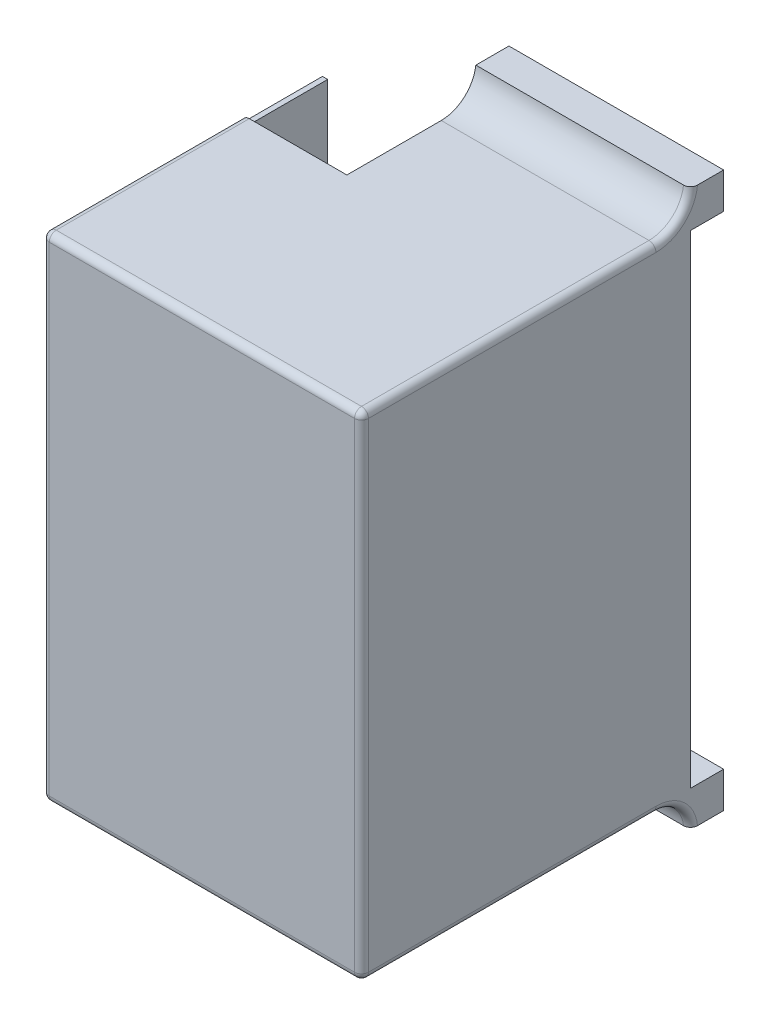
ISO-10303-21;
HEADER;
FILE_DESCRIPTION(('STEP AP214'),'2;1');
FILE_NAME('part.step','',(''),(''),'','','');
FILE_SCHEMA(('AUTOMOTIVE_DESIGN { 1 0 10303 214 1 1 1 1 }'));
ENDSEC;
DATA;
#1=APPLICATION_CONTEXT('core data for automotive mechanical design processes');
#2=APPLICATION_PROTOCOL_DEFINITION('international standard','automotive_design',2000,#1);
#3=PRODUCT_CONTEXT('',#1,'mechanical');
#4=PRODUCT('Part','Part','',(#3));
#5=PRODUCT_RELATED_PRODUCT_CATEGORY('part','',(#4));
#6=PRODUCT_DEFINITION_FORMATION('','',#4);
#7=PRODUCT_DEFINITION_CONTEXT('part definition',#1,'design');
#8=PRODUCT_DEFINITION('design','',#6,#7);
#9=PRODUCT_DEFINITION_SHAPE('','',#8);
#10=(LENGTH_UNIT() NAMED_UNIT(*) SI_UNIT(.MILLI.,.METRE.));
#11=(NAMED_UNIT(*) PLANE_ANGLE_UNIT() SI_UNIT($,.RADIAN.));
#12=(NAMED_UNIT(*) SI_UNIT($,.STERADIAN.) SOLID_ANGLE_UNIT());
#13=UNCERTAINTY_MEASURE_WITH_UNIT(LENGTH_MEASURE(1.E-05),#10,'distance_accuracy_value','');
#14=(GEOMETRIC_REPRESENTATION_CONTEXT(3) GLOBAL_UNCERTAINTY_ASSIGNED_CONTEXT((#13)) GLOBAL_UNIT_ASSIGNED_CONTEXT((#10,
#11,#12)) REPRESENTATION_CONTEXT('',''));
#15=CARTESIAN_POINT('',(0.,0.,0.));
#16=DIRECTION('',(0.,0.,1.));
#17=DIRECTION('',(1.,0.,0.));
#18=AXIS2_PLACEMENT_3D('',#15,#16,#17);
#19=CARTESIAN_POINT('',(91.6,0.,0.));
#20=DIRECTION('',(0.,0.,1.));
#21=DIRECTION('',(1.,0.,0.));
#22=AXIS2_PLACEMENT_3D('',#19,#20,#21);
#23=PLANE('',#22);
#24=DIRECTION('',(-1.,0.,0.));
#25=VECTOR('',#24,1.);
#26=CARTESIAN_POINT('',(91.6,140.1,0.));
#27=LINE('',#26,#25);
#28=CARTESIAN_POINT('',(91.6,140.1,0.));
#29=VERTEX_POINT('',#28);
#30=CARTESIAN_POINT('',(90.1,140.1,0.));
#31=VERTEX_POINT('',#30);
#32=EDGE_CURVE('E628',#29,#31,#27,.T.);
#33=ORIENTED_EDGE('',*,*,#32,.F.);
#34=DIRECTION('',(0.,1.,0.));
#35=VECTOR('',#34,1.);
#36=CARTESIAN_POINT('',(91.6,0.,0.));
#37=LINE('',#36,#35);
#38=CARTESIAN_POINT('',(91.6,1.5,0.));
#39=VERTEX_POINT('',#38);
#40=EDGE_CURVE('E321',#39,#29,#37,.T.);
#41=ORIENTED_EDGE('',*,*,#40,.F.);
#42=DIRECTION('',(1.,0.,0.));
#43=VECTOR('',#42,1.);
#44=CARTESIAN_POINT('',(91.6,1.5,0.));
#45=LINE('',#44,#43);
#46=CARTESIAN_POINT('',(90.1,1.5,0.));
#47=VERTEX_POINT('',#46);
#48=EDGE_CURVE('E347',#47,#39,#45,.T.);
#49=ORIENTED_EDGE('',*,*,#48,.F.);
#50=DIRECTION('',(0.,1.,0.));
#51=VECTOR('',#50,1.);
#52=CARTESIAN_POINT('',(90.1,0.,0.));
#53=LINE('',#52,#51);
#54=EDGE_CURVE('E305',#47,#31,#53,.T.);
#55=ORIENTED_EDGE('',*,*,#54,.T.);
#56=EDGE_LOOP('',(#33,#41,#49,#55));
#57=FACE_BOUND('',#56,.T.);
#58=ADVANCED_FACE('F47',(#57),#23,.F.);
#59=CARTESIAN_POINT('',(91.6,0.,0.));
#60=DIRECTION('',(0.,1.,0.));
#61=DIRECTION('',(0.,0.,1.));
#62=AXIS2_PLACEMENT_3D('',#59,#60,#61);
#63=PLANE('',#62);
#64=DIRECTION('',(-1.,0.,0.));
#65=VECTOR('',#64,1.);
#66=CARTESIAN_POINT('',(91.6,0.,92.4));
#67=LINE('',#66,#65);
#68=CARTESIAN_POINT('',(89.6,0.,92.4));
#69=VERTEX_POINT('',#68);
#70=CARTESIAN_POINT('',(2.,0.,92.4));
#71=VERTEX_POINT('',#70);
#72=EDGE_CURVE('E564',#69,#71,#67,.T.);
#73=ORIENTED_EDGE('',*,*,#72,.T.);
#74=DIRECTION('',(0.,0.,-1.));
#75=VECTOR('',#74,1.);
#76=CARTESIAN_POINT('',(2.,0.,14.));
#77=LINE('',#76,#75);
#78=CARTESIAN_POINT('',(2.,0.,14.));
#79=VERTEX_POINT('',#78);
#80=EDGE_CURVE('E611',#71,#79,#77,.T.);
#81=ORIENTED_EDGE('',*,*,#80,.T.);
#82=DIRECTION('',(0.,0.,1.));
#83=VECTOR('',#82,1.);
#84=CARTESIAN_POINT('',(2.,0.,0.));
#85=LINE('',#84,#83);
#86=CARTESIAN_POINT('',(2.,0.,9.92773891679268));
#87=VERTEX_POINT('',#86);
#88=EDGE_CURVE('E288',#87,#79,#85,.T.);
#89=ORIENTED_EDGE('',*,*,#88,.F.);
#90=DIRECTION('',(-1.,0.,0.));
#91=VECTOR('',#90,1.);
#92=CARTESIAN_POINT('',(91.6,0.,9.92773891679268));
#93=LINE('',#92,#91);
#94=CARTESIAN_POINT('',(89.6,0.,9.92773891679268));
#95=VERTEX_POINT('',#94);
#96=EDGE_CURVE('E348',#87,#95,#93,.F.);
#97=ORIENTED_EDGE('',*,*,#96,.T.);
#98=DIRECTION('',(0.,0.,-1.));
#99=VECTOR('',#98,1.);
#100=CARTESIAN_POINT('',(89.6,0.,0.));
#101=LINE('',#100,#99);
#102=EDGE_CURVE('E568',#95,#69,#101,.F.);
#103=ORIENTED_EDGE('',*,*,#102,.T.);
#104=EDGE_LOOP('',(#73,#81,#89,#97,#103));
#105=FACE_BOUND('',#104,.T.);
#106=ADVANCED_FACE('F466',(#105),#63,.F.);
#107=CARTESIAN_POINT('',(91.6,141.6,0.));
#108=DIRECTION('',(0.,-1.,0.));
#109=DIRECTION('',(0.,0.,-1.));
#110=AXIS2_PLACEMENT_3D('',#107,#108,#109);
#111=PLANE('',#110);
#112=DIRECTION('',(1.,0.,0.));
#113=VECTOR('',#112,1.);
#114=CARTESIAN_POINT('',(30.,141.6,37.));
#115=LINE('',#114,#113);
#116=CARTESIAN_POINT('',(2.00000000000001,141.6,37.));
#117=VERTEX_POINT('',#116);
#118=CARTESIAN_POINT('',(30.,141.6,37.));
#119=VERTEX_POINT('',#118);
#120=EDGE_CURVE('E267',#117,#119,#115,.T.);
#121=ORIENTED_EDGE('',*,*,#120,.F.);
#122=DIRECTION('',(0.,0.,1.));
#123=VECTOR('',#122,1.);
#124=CARTESIAN_POINT('',(2.,141.6,94.4));
#125=LINE('',#124,#123);
#126=CARTESIAN_POINT('',(2.,141.6,92.4));
#127=VERTEX_POINT('',#126);
#128=EDGE_CURVE('E591',#117,#127,#125,.T.);
#129=ORIENTED_EDGE('',*,*,#128,.T.);
#130=DIRECTION('',(-1.,0.,0.));
#131=VECTOR('',#130,1.);
#132=CARTESIAN_POINT('',(91.6,141.6,92.4));
#133=LINE('',#132,#131);
#134=CARTESIAN_POINT('',(89.6,141.6,92.4));
#135=VERTEX_POINT('',#134);
#136=EDGE_CURVE('E596',#127,#135,#133,.F.);
#137=ORIENTED_EDGE('',*,*,#136,.T.);
#138=DIRECTION('',(0.,0.,1.));
#139=VECTOR('',#138,1.);
#140=CARTESIAN_POINT('',(89.6,141.6,0.));
#141=LINE('',#140,#139);
#142=CARTESIAN_POINT('',(89.6,141.6,9.92773891679269));
#143=VERTEX_POINT('',#142);
#144=EDGE_CURVE('E500',#135,#143,#141,.F.);
#145=ORIENTED_EDGE('',*,*,#144,.T.);
#146=DIRECTION('',(1.,0.,0.));
#147=VECTOR('',#146,1.);
#148=CARTESIAN_POINT('',(91.6,141.6,9.92773891679269));
#149=LINE('',#148,#147);
#150=CARTESIAN_POINT('',(30.,141.6,9.92773891679269));
#151=VERTEX_POINT('',#150);
#152=EDGE_CURVE('E352',#143,#151,#149,.F.);
#153=ORIENTED_EDGE('',*,*,#152,.T.);
#154=DIRECTION('',(0.,0.,-1.));
#155=VECTOR('',#154,1.);
#156=CARTESIAN_POINT('',(30.,141.6,0.));
#157=LINE('',#156,#155);
#158=EDGE_CURVE('E256',#119,#151,#157,.T.);
#159=ORIENTED_EDGE('',*,*,#158,.F.);
#160=EDGE_LOOP('',(#121,#129,#137,#145,#153,#159));
#161=FACE_BOUND('',#160,.T.);
#162=ADVANCED_FACE('F463',(#161),#111,.F.);
#163=CARTESIAN_POINT('',(91.6,0.,94.4));
#164=DIRECTION('',(0.,0.,-1.));
#165=DIRECTION('',(-1.,0.,0.));
#166=AXIS2_PLACEMENT_3D('',#163,#164,#165);
#167=PLANE('',#166);
#168=DIRECTION('',(-1.,0.,0.));
#169=VECTOR('',#168,1.);
#170=CARTESIAN_POINT('',(91.6,139.6,94.4));
#171=LINE('',#170,#169);
#172=CARTESIAN_POINT('',(89.6,139.6,94.4));
#173=VERTEX_POINT('',#172);
#174=CARTESIAN_POINT('',(2.,139.6,94.4));
#175=VERTEX_POINT('',#174);
#176=EDGE_CURVE('E582',#173,#175,#171,.T.);
#177=ORIENTED_EDGE('',*,*,#176,.T.);
#178=DIRECTION('',(0.,-1.,0.));
#179=VECTOR('',#178,1.);
#180=CARTESIAN_POINT('',(2.,0.,94.4));
#181=LINE('',#180,#179);
#182=CARTESIAN_POINT('',(2.,2.,94.4));
#183=VERTEX_POINT('',#182);
#184=EDGE_CURVE('E11',#175,#183,#181,.T.);
#185=ORIENTED_EDGE('',*,*,#184,.T.);
#186=DIRECTION('',(-1.,0.,0.));
#187=VECTOR('',#186,1.);
#188=CARTESIAN_POINT('',(91.6,2.,94.4));
#189=LINE('',#188,#187);
#190=CARTESIAN_POINT('',(89.6,2.,94.4));
#191=VERTEX_POINT('',#190);
#192=EDGE_CURVE('E57',#183,#191,#189,.F.);
#193=ORIENTED_EDGE('',*,*,#192,.T.);
#194=DIRECTION('',(0.,-1.,0.));
#195=VECTOR('',#194,1.);
#196=CARTESIAN_POINT('',(89.6,0.,94.4));
#197=LINE('',#196,#195);
#198=EDGE_CURVE('E578',#191,#173,#197,.F.);
#199=ORIENTED_EDGE('',*,*,#198,.T.);
#200=EDGE_LOOP('',(#177,#185,#193,#199));
#201=FACE_BOUND('',#200,.T.);
#202=ADVANCED_FACE('F456',(#201),#167,.F.);
#203=CARTESIAN_POINT('',(91.6,0.,0.));
#204=DIRECTION('',(-1.,0.,0.));
#205=DIRECTION('',(0.,0.,1.));
#206=AXIS2_PLACEMENT_3D('',#203,#204,#205);
#207=PLANE('',#206);
#208=DIRECTION('',(0.,0.,1.));
#209=VECTOR('',#208,1.);
#210=CARTESIAN_POINT('',(91.6,150.4,-9.5));
#211=LINE('',#210,#209);
#212=CARTESIAN_POINT('',(91.6,150.4,-9.5));
#213=VERTEX_POINT('',#212);
#214=CARTESIAN_POINT('',(91.6,150.4,-2.01211032848676));
#215=VERTEX_POINT('',#214);
#216=EDGE_CURVE('E673',#213,#215,#211,.T.);
#217=ORIENTED_EDGE('',*,*,#216,.T.);
#218=CARTESIAN_POINT('',(91.6,151.6,9.92773891679269));
#219=DIRECTION('',(-1.,0.,0.));
#220=DIRECTION('',(0.,0.,1.));
#221=AXIS2_PLACEMENT_3D('',#218,#219,#220);
#222=CIRCLE('',#221,12.);
#223=CARTESIAN_POINT('',(91.6,139.6,9.92773891679269));
#224=VERTEX_POINT('',#223);
#225=EDGE_CURVE('E373',#215,#224,#222,.T.);
#226=ORIENTED_EDGE('',*,*,#225,.T.);
#227=DIRECTION('',(0.,0.,1.));
#228=VECTOR('',#227,1.);
#229=CARTESIAN_POINT('',(91.6,139.6,0.));
#230=LINE('',#229,#228);
#231=CARTESIAN_POINT('',(91.6,139.6,92.4));
#232=VERTEX_POINT('',#231);
#233=EDGE_CURVE('E367',#224,#232,#230,.T.);
#234=ORIENTED_EDGE('',*,*,#233,.T.);
#235=DIRECTION('',(0.,-1.,0.));
#236=VECTOR('',#235,1.);
#237=CARTESIAN_POINT('',(91.6,0.,92.4));
#238=LINE('',#237,#236);
#239=CARTESIAN_POINT('',(91.6,2.,92.4));
#240=VERTEX_POINT('',#239);
#241=EDGE_CURVE('E361',#232,#240,#238,.T.);
#242=ORIENTED_EDGE('',*,*,#241,.T.);
#243=DIRECTION('',(0.,0.,-1.));
#244=VECTOR('',#243,1.);
#245=CARTESIAN_POINT('',(91.6,2.,0.));
#246=LINE('',#245,#244);
#247=CARTESIAN_POINT('',(91.6,2.,9.92773891679268));
#248=VERTEX_POINT('',#247);
#249=EDGE_CURVE('E364',#240,#248,#246,.T.);
#250=ORIENTED_EDGE('',*,*,#249,.T.);
#251=CARTESIAN_POINT('',(91.6,-10.,9.92773891679268));
#252=DIRECTION('',(-1.,0.,0.));
#253=DIRECTION('',(0.,0.,1.));
#254=AXIS2_PLACEMENT_3D('',#251,#252,#253);
#255=CIRCLE('',#254,12.);
#256=CARTESIAN_POINT('',(91.6,-8.8,-2.01211032848675));
#257=VERTEX_POINT('',#256);
#258=EDGE_CURVE('E370',#248,#257,#255,.T.);
#259=ORIENTED_EDGE('',*,*,#258,.T.);
#260=DIRECTION('',(0.,0.,1.));
#261=VECTOR('',#260,1.);
#262=CARTESIAN_POINT('',(91.6,-8.8,-9.5));
#263=LINE('',#262,#261);
#264=CARTESIAN_POINT('',(91.6,-8.8,-9.5));
#265=VERTEX_POINT('',#264);
#266=EDGE_CURVE('E258',#265,#257,#263,.T.);
#267=ORIENTED_EDGE('',*,*,#266,.F.);
#268=DIRECTION('',(0.,1.,0.));
#269=VECTOR('',#268,1.);
#270=CARTESIAN_POINT('',(91.6,0.,-9.49999999999999));
#271=LINE('',#270,#269);
#272=CARTESIAN_POINT('',(91.6,1.5,-9.49999999999999));
#273=VERTEX_POINT('',#272);
#274=EDGE_CURVE('E252',#265,#273,#271,.T.);
#275=ORIENTED_EDGE('',*,*,#274,.T.);
#276=DIRECTION('',(0.,0.,1.));
#277=VECTOR('',#276,1.);
#278=CARTESIAN_POINT('',(91.6,1.5,-101.112280836141));
#279=LINE('',#278,#277);
#280=EDGE_CURVE('E250',#273,#39,#279,.T.);
#281=ORIENTED_EDGE('',*,*,#280,.T.);
#282=ORIENTED_EDGE('',*,*,#40,.T.);
#283=DIRECTION('',(0.,0.,1.));
#284=VECTOR('',#283,1.);
#285=CARTESIAN_POINT('',(91.6,140.1,-101.112280836141));
#286=LINE('',#285,#284);
#287=CARTESIAN_POINT('',(91.6,140.1,-9.49999999999999));
#288=VERTEX_POINT('',#287);
#289=EDGE_CURVE('E686',#288,#29,#286,.T.);
#290=ORIENTED_EDGE('',*,*,#289,.F.);
#291=DIRECTION('',(0.,1.,0.));
#292=VECTOR('',#291,1.);
#293=CARTESIAN_POINT('',(91.6,141.6,-9.49999999999999));
#294=LINE('',#293,#292);
#295=EDGE_CURVE('E682',#288,#213,#294,.T.);
#296=ORIENTED_EDGE('',*,*,#295,.T.);
#297=EDGE_LOOP('',(#217,#226,#234,#242,#250,#259,#267,#275,#281,#282,#290,#296));
#298=FACE_BOUND('',#297,.T.);
#299=ADVANCED_FACE('F453',(#298),#207,.F.);
#300=CARTESIAN_POINT('',(0.,0.,0.));
#301=DIRECTION('',(-1.,0.,0.));
#302=DIRECTION('',(0.,0.,1.));
#303=AXIS2_PLACEMENT_3D('',#300,#301,#302);
#304=PLANE('',#303);
#305=DIRECTION('',(0.,1.,0.));
#306=VECTOR('',#305,1.);
#307=CARTESIAN_POINT('',(0.,141.6,14.));
#308=LINE('',#307,#306);
#309=CARTESIAN_POINT('',(0.,2.,14.));
#310=VERTEX_POINT('',#309);
#311=CARTESIAN_POINT('',(0.,139.6,14.));
#312=VERTEX_POINT('',#311);
#313=EDGE_CURVE('E287',#310,#312,#308,.T.);
#314=ORIENTED_EDGE('',*,*,#313,.F.);
#315=DIRECTION('',(0.,0.,-1.));
#316=VECTOR('',#315,1.);
#317=CARTESIAN_POINT('',(0.,2.,94.4));
#318=LINE('',#317,#316);
#319=CARTESIAN_POINT('',(0.,2.,92.4));
#320=VERTEX_POINT('',#319);
#321=EDGE_CURVE('E599',#310,#320,#318,.F.);
#322=ORIENTED_EDGE('',*,*,#321,.T.);
#323=DIRECTION('',(0.,-1.,0.));
#324=VECTOR('',#323,1.);
#325=CARTESIAN_POINT('',(0.,141.6,92.4));
#326=LINE('',#325,#324);
#327=CARTESIAN_POINT('',(0.,139.6,92.4));
#328=VERTEX_POINT('',#327);
#329=EDGE_CURVE('E605',#320,#328,#326,.F.);
#330=ORIENTED_EDGE('',*,*,#329,.T.);
#331=DIRECTION('',(0.,0.,1.));
#332=VECTOR('',#331,1.);
#333=CARTESIAN_POINT('',(0.,139.6,37.));
#334=LINE('',#333,#332);
#335=CARTESIAN_POINT('',(0.,139.6,37.));
#336=VERTEX_POINT('',#335);
#337=EDGE_CURVE('E602',#328,#336,#334,.F.);
#338=ORIENTED_EDGE('',*,*,#337,.T.);
#339=DIRECTION('',(0.,0.,1.));
#340=VECTOR('',#339,1.);
#341=CARTESIAN_POINT('',(0.,139.6,0.));
#342=LINE('',#341,#340);
#343=EDGE_CURVE('E262',#312,#336,#342,.T.);
#344=ORIENTED_EDGE('',*,*,#343,.F.);
#345=EDGE_LOOP('',(#314,#322,#330,#338,#344));
#346=FACE_BOUND('',#345,.T.);
#347=ADVANCED_FACE('F438',(#346),#304,.T.);
#348=CARTESIAN_POINT('',(91.6,1.5,0.));
#349=DIRECTION('',(0.,1.,0.));
#350=DIRECTION('',(0.,0.,1.));
#351=AXIS2_PLACEMENT_3D('',#348,#349,#350);
#352=PLANE('',#351);
#353=DIRECTION('',(-1.,0.,0.));
#354=VECTOR('',#353,1.);
#355=CARTESIAN_POINT('',(91.6,1.5,-9.49999999999999));
#356=LINE('',#355,#354);
#357=CARTESIAN_POINT('',(2.,1.5,-9.5));
#358=VERTEX_POINT('',#357);
#359=EDGE_CURVE('E239',#273,#358,#356,.T.);
#360=ORIENTED_EDGE('',*,*,#359,.T.);
#361=DIRECTION('',(0.,0.,-1.));
#362=VECTOR('',#361,1.);
#363=CARTESIAN_POINT('',(2.,1.5,0.));
#364=LINE('',#363,#362);
#365=CARTESIAN_POINT('',(2.,1.5,14.));
#366=VERTEX_POINT('',#365);
#367=EDGE_CURVE('E220',#366,#358,#364,.T.);
#368=ORIENTED_EDGE('',*,*,#367,.F.);
#369=DIRECTION('',(1.,0.,0.));
#370=VECTOR('',#369,1.);
#371=CARTESIAN_POINT('',(91.6,1.5,14.));
#372=LINE('',#371,#370);
#373=CARTESIAN_POINT('',(1.5,1.5,14.));
#374=VERTEX_POINT('',#373);
#375=EDGE_CURVE('E234',#374,#366,#372,.T.);
#376=ORIENTED_EDGE('',*,*,#375,.F.);
#377=DIRECTION('',(0.,0.,-1.));
#378=VECTOR('',#377,1.);
#379=CARTESIAN_POINT('',(1.5,1.5,0.));
#380=LINE('',#379,#378);
#381=CARTESIAN_POINT('',(1.5,1.5,92.9));
#382=VERTEX_POINT('',#381);
#383=EDGE_CURVE('E233',#382,#374,#380,.T.);
#384=ORIENTED_EDGE('',*,*,#383,.F.);
#385=DIRECTION('',(-1.,0.,0.));
#386=VECTOR('',#385,1.);
#387=CARTESIAN_POINT('',(91.6,1.5,92.9));
#388=LINE('',#387,#386);
#389=CARTESIAN_POINT('',(90.1,1.5,92.9));
#390=VERTEX_POINT('',#389);
#391=EDGE_CURVE('E307',#390,#382,#388,.T.);
#392=ORIENTED_EDGE('',*,*,#391,.F.);
#393=DIRECTION('',(0.,0.,-1.));
#394=VECTOR('',#393,1.);
#395=CARTESIAN_POINT('',(90.1,1.5,0.));
#396=LINE('',#395,#394);
#397=EDGE_CURVE('E301',#390,#47,#396,.T.);
#398=ORIENTED_EDGE('',*,*,#397,.T.);
#399=ORIENTED_EDGE('',*,*,#48,.T.);
#400=ORIENTED_EDGE('',*,*,#280,.F.);
#401=EDGE_LOOP('',(#360,#368,#376,#384,#392,#398,#399,#400));
#402=FACE_BOUND('',#401,.T.);
#403=ADVANCED_FACE('F247',(#402),#352,.T.);
#404=CARTESIAN_POINT('',(91.6,140.1,0.));
#405=DIRECTION('',(0.,-1.,0.));
#406=DIRECTION('',(0.,0.,-1.));
#407=AXIS2_PLACEMENT_3D('',#404,#405,#406);
#408=PLANE('',#407);
#409=DIRECTION('',(0.,0.,1.));
#410=VECTOR('',#409,1.);
#411=CARTESIAN_POINT('',(30.,140.1,0.));
#412=LINE('',#411,#410);
#413=CARTESIAN_POINT('',(30.,140.1,-9.49999999999999));
#414=VERTEX_POINT('',#413);
#415=CARTESIAN_POINT('',(30.,140.1,37.));
#416=VERTEX_POINT('',#415);
#417=EDGE_CURVE('E344',#414,#416,#412,.T.);
#418=ORIENTED_EDGE('',*,*,#417,.F.);
#419=DIRECTION('',(1.,0.,0.));
#420=VECTOR('',#419,1.);
#421=CARTESIAN_POINT('',(91.6,140.1,-9.49999999999999));
#422=LINE('',#421,#420);
#423=EDGE_CURVE('E695',#414,#288,#422,.T.);
#424=ORIENTED_EDGE('',*,*,#423,.T.);
#425=ORIENTED_EDGE('',*,*,#289,.T.);
#426=ORIENTED_EDGE('',*,*,#32,.T.);
#427=DIRECTION('',(0.,0.,1.));
#428=VECTOR('',#427,1.);
#429=CARTESIAN_POINT('',(90.1,140.1,0.));
#430=LINE('',#429,#428);
#431=CARTESIAN_POINT('',(90.1,140.1,92.9));
#432=VERTEX_POINT('',#431);
#433=EDGE_CURVE('E317',#31,#432,#430,.T.);
#434=ORIENTED_EDGE('',*,*,#433,.T.);
#435=DIRECTION('',(-1.,0.,0.));
#436=VECTOR('',#435,1.);
#437=CARTESIAN_POINT('',(91.6,140.1,92.9));
#438=LINE('',#437,#436);
#439=CARTESIAN_POINT('',(1.5,140.1,92.9));
#440=VERTEX_POINT('',#439);
#441=EDGE_CURVE('E311',#432,#440,#438,.T.);
#442=ORIENTED_EDGE('',*,*,#441,.T.);
#443=DIRECTION('',(0.,0.,1.));
#444=VECTOR('',#443,1.);
#445=CARTESIAN_POINT('',(1.5,140.1,0.));
#446=LINE('',#445,#444);
#447=CARTESIAN_POINT('',(1.5,140.1,37.));
#448=VERTEX_POINT('',#447);
#449=EDGE_CURVE('E300',#448,#440,#446,.T.);
#450=ORIENTED_EDGE('',*,*,#449,.F.);
#451=DIRECTION('',(-1.,0.,0.));
#452=VECTOR('',#451,1.);
#453=CARTESIAN_POINT('',(91.6,140.1,37.));
#454=LINE('',#453,#452);
#455=EDGE_CURVE('E284',#416,#448,#454,.T.);
#456=ORIENTED_EDGE('',*,*,#455,.F.);
#457=EDGE_LOOP('',(#418,#424,#425,#426,#434,#442,#450,#456));
#458=FACE_BOUND('',#457,.T.);
#459=ADVANCED_FACE('F437',(#458),#408,.T.);
#460=CARTESIAN_POINT('',(91.6,0.,92.9));
#461=DIRECTION('',(0.,0.,-1.));
#462=DIRECTION('',(-1.,0.,0.));
#463=AXIS2_PLACEMENT_3D('',#460,#461,#462);
#464=PLANE('',#463);
#465=DIRECTION('',(0.,-1.,0.));
#466=VECTOR('',#465,1.);
#467=CARTESIAN_POINT('',(1.5,0.,92.9));
#468=LINE('',#467,#466);
#469=EDGE_CURVE('E306',#440,#382,#468,.T.);
#470=ORIENTED_EDGE('',*,*,#469,.F.);
#471=ORIENTED_EDGE('',*,*,#441,.F.);
#472=DIRECTION('',(0.,-1.,0.));
#473=VECTOR('',#472,1.);
#474=CARTESIAN_POINT('',(90.1,0.,92.9));
#475=LINE('',#474,#473);
#476=EDGE_CURVE('E312',#432,#390,#475,.T.);
#477=ORIENTED_EDGE('',*,*,#476,.T.);
#478=ORIENTED_EDGE('',*,*,#391,.T.);
#479=EDGE_LOOP('',(#470,#471,#477,#478));
#480=FACE_BOUND('',#479,.T.);
#481=ADVANCED_FACE('F441',(#480),#464,.T.);
#482=CARTESIAN_POINT('',(90.1,0.,0.));
#483=DIRECTION('',(-1.,0.,0.));
#484=DIRECTION('',(0.,0.,1.));
#485=AXIS2_PLACEMENT_3D('',#482,#483,#484);
#486=PLANE('',#485);
#487=ORIENTED_EDGE('',*,*,#397,.F.);
#488=ORIENTED_EDGE('',*,*,#476,.F.);
#489=ORIENTED_EDGE('',*,*,#433,.F.);
#490=ORIENTED_EDGE('',*,*,#54,.F.);
#491=EDGE_LOOP('',(#487,#488,#489,#490));
#492=FACE_BOUND('',#491,.T.);
#493=ADVANCED_FACE('F445',(#492),#486,.T.);
#494=CARTESIAN_POINT('',(1.5,0.,0.));
#495=DIRECTION('',(-1.,0.,0.));
#496=DIRECTION('',(0.,0.,1.));
#497=AXIS2_PLACEMENT_3D('',#494,#495,#496);
#498=PLANE('',#497);
#499=DIRECTION('',(0.,0.,1.));
#500=VECTOR('',#499,1.);
#501=CARTESIAN_POINT('',(1.5,139.6,0.));
#502=LINE('',#501,#500);
#503=CARTESIAN_POINT('',(1.5,139.6,14.));
#504=VERTEX_POINT('',#503);
#505=CARTESIAN_POINT('',(1.50000000000001,139.6,37.));
#506=VERTEX_POINT('',#505);
#507=EDGE_CURVE('E280',#504,#506,#502,.T.);
#508=ORIENTED_EDGE('',*,*,#507,.T.);
#509=DIRECTION('',(0.,1.,0.));
#510=VECTOR('',#509,1.);
#511=CARTESIAN_POINT('',(1.5,0.,37.));
#512=LINE('',#511,#510);
#513=EDGE_CURVE('E340',#506,#448,#512,.T.);
#514=ORIENTED_EDGE('',*,*,#513,.T.);
#515=ORIENTED_EDGE('',*,*,#449,.T.);
#516=ORIENTED_EDGE('',*,*,#469,.T.);
#517=ORIENTED_EDGE('',*,*,#383,.T.);
#518=DIRECTION('',(0.,1.,0.));
#519=VECTOR('',#518,1.);
#520=CARTESIAN_POINT('',(1.5,0.,14.));
#521=LINE('',#520,#519);
#522=EDGE_CURVE('E332',#374,#504,#521,.T.);
#523=ORIENTED_EDGE('',*,*,#522,.T.);
#524=EDGE_LOOP('',(#508,#514,#515,#516,#517,#523));
#525=FACE_BOUND('',#524,.T.);
#526=ADVANCED_FACE('F431',(#525),#498,.F.);
#527=CARTESIAN_POINT('',(2.,0.,0.));
#528=DIRECTION('',(1.,0.,0.));
#529=DIRECTION('',(0.,0.,-1.));
#530=AXIS2_PLACEMENT_3D('',#527,#528,#529);
#531=PLANE('',#530);
#532=ORIENTED_EDGE('',*,*,#367,.T.);
#533=DIRECTION('',(0.,1.,0.));
#534=VECTOR('',#533,1.);
#535=CARTESIAN_POINT('',(2.,-8.79999999999999,-9.5));
#536=LINE('',#535,#534);
#537=CARTESIAN_POINT('',(2.,-8.79999999999999,-9.5));
#538=VERTEX_POINT('',#537);
#539=EDGE_CURVE('E224',#538,#358,#536,.T.);
#540=ORIENTED_EDGE('',*,*,#539,.F.);
#541=DIRECTION('',(0.,0.,1.));
#542=VECTOR('',#541,1.);
#543=CARTESIAN_POINT('',(2.,-8.79999999999999,-9.5));
#544=LINE('',#543,#542);
#545=CARTESIAN_POINT('',(2.,-8.79999999999999,0.));
#546=VERTEX_POINT('',#545);
#547=EDGE_CURVE('E244',#538,#546,#544,.T.);
#548=ORIENTED_EDGE('',*,*,#547,.T.);
#549=CARTESIAN_POINT('',(2.,-10.,9.92773891679268));
#550=DIRECTION('',(1.,0.,0.));
#551=DIRECTION('',(0.,0.,-1.));
#552=AXIS2_PLACEMENT_3D('',#549,#550,#551);
#553=CIRCLE('',#552,10.);
#554=EDGE_CURVE('E355',#546,#87,#553,.T.);
#555=ORIENTED_EDGE('',*,*,#554,.T.);
#556=ORIENTED_EDGE('',*,*,#88,.T.);
#557=DIRECTION('',(0.,1.,0.));
#558=VECTOR('',#557,1.);
#559=CARTESIAN_POINT('',(2.,141.6,14.));
#560=LINE('',#559,#558);
#561=EDGE_CURVE('E228',#79,#366,#560,.T.);
#562=ORIENTED_EDGE('',*,*,#561,.T.);
#563=EDGE_LOOP('',(#532,#540,#548,#555,#556,#562));
#564=FACE_BOUND('',#563,.T.);
#565=ADVANCED_FACE('F222',(#564),#531,.F.);
#566=CARTESIAN_POINT('',(2.,141.6,14.));
#567=DIRECTION('',(0.,0.,1.));
#568=DIRECTION('',(0.,-1.,0.));
#569=AXIS2_PLACEMENT_3D('',#566,#567,#568);
#570=PLANE('',#569);
#571=ORIENTED_EDGE('',*,*,#561,.F.);
#572=CARTESIAN_POINT('',(2.,2.,14.));
#573=DIRECTION('',(0.,0.,1.));
#574=DIRECTION('',(0.,-1.,0.));
#575=AXIS2_PLACEMENT_3D('',#572,#573,#574);
#576=CIRCLE('',#575,2.);
#577=EDGE_CURVE('E608',#79,#310,#576,.F.);
#578=ORIENTED_EDGE('',*,*,#577,.T.);
#579=ORIENTED_EDGE('',*,*,#313,.T.);
#580=DIRECTION('',(1.,0.,0.));
#581=VECTOR('',#580,1.);
#582=CARTESIAN_POINT('',(2.,139.6,14.));
#583=LINE('',#582,#581);
#584=EDGE_CURVE('E336',#312,#504,#583,.T.);
#585=ORIENTED_EDGE('',*,*,#584,.T.);
#586=ORIENTED_EDGE('',*,*,#522,.F.);
#587=ORIENTED_EDGE('',*,*,#375,.T.);
#588=EDGE_LOOP('',(#571,#578,#579,#585,#586,#587));
#589=FACE_BOUND('',#588,.T.);
#590=ADVANCED_FACE('F421',(#589),#570,.F.);
#591=CARTESIAN_POINT('',(0.,139.6,0.));
#592=DIRECTION('',(0.,-1.,0.));
#593=DIRECTION('',(0.,0.,-1.));
#594=AXIS2_PLACEMENT_3D('',#591,#592,#593);
#595=PLANE('',#594);
#596=ORIENTED_EDGE('',*,*,#584,.F.);
#597=ORIENTED_EDGE('',*,*,#343,.T.);
#598=DIRECTION('',(1.,0.,0.));
#599=VECTOR('',#598,1.);
#600=CARTESIAN_POINT('',(30.,139.6,37.));
#601=LINE('',#600,#599);
#602=EDGE_CURVE('E266',#336,#506,#601,.T.);
#603=ORIENTED_EDGE('',*,*,#602,.T.);
#604=ORIENTED_EDGE('',*,*,#507,.F.);
#605=EDGE_LOOP('',(#596,#597,#603,#604));
#606=FACE_BOUND('',#605,.T.);
#607=ADVANCED_FACE('F417',(#606),#595,.F.);
#608=CARTESIAN_POINT('',(30.,139.6,0.));
#609=DIRECTION('',(1.,0.,0.));
#610=DIRECTION('',(0.,0.,-1.));
#611=AXIS2_PLACEMENT_3D('',#608,#609,#610);
#612=PLANE('',#611);
#613=ORIENTED_EDGE('',*,*,#417,.T.);
#614=DIRECTION('',(0.,1.,0.));
#615=VECTOR('',#614,1.);
#616=CARTESIAN_POINT('',(30.,139.6,37.));
#617=LINE('',#616,#615);
#618=EDGE_CURVE('E271',#416,#119,#617,.T.);
#619=ORIENTED_EDGE('',*,*,#618,.T.);
#620=ORIENTED_EDGE('',*,*,#158,.T.);
#621=CARTESIAN_POINT('',(30.,151.6,9.92773891679269));
#622=DIRECTION('',(1.,0.,0.));
#623=DIRECTION('',(0.,0.,-1.));
#624=AXIS2_PLACEMENT_3D('',#621,#622,#623);
#625=CIRCLE('',#624,10.);
#626=CARTESIAN_POINT('',(30.,150.4,0.));
#627=VERTEX_POINT('',#626);
#628=EDGE_CURVE('E358',#151,#627,#625,.T.);
#629=ORIENTED_EDGE('',*,*,#628,.T.);
#630=DIRECTION('',(0.,0.,1.));
#631=VECTOR('',#630,1.);
#632=CARTESIAN_POINT('',(30.,150.4,-9.5));
#633=LINE('',#632,#631);
#634=CARTESIAN_POINT('',(30.,150.4,-9.5));
#635=VERTEX_POINT('',#634);
#636=EDGE_CURVE('E669',#635,#627,#633,.T.);
#637=ORIENTED_EDGE('',*,*,#636,.F.);
#638=DIRECTION('',(0.,-1.,0.));
#639=VECTOR('',#638,1.);
#640=CARTESIAN_POINT('',(30.,141.6,-9.49999999999999));
#641=LINE('',#640,#639);
#642=EDGE_CURVE('E690',#635,#414,#641,.T.);
#643=ORIENTED_EDGE('',*,*,#642,.T.);
#644=EDGE_LOOP('',(#613,#619,#620,#629,#637,#643));
#645=FACE_BOUND('',#644,.T.);
#646=ADVANCED_FACE('F420',(#645),#612,.F.);
#647=CARTESIAN_POINT('',(30.,139.6,37.));
#648=DIRECTION('',(0.,0.,1.));
#649=DIRECTION('',(1.,0.,0.));
#650=AXIS2_PLACEMENT_3D('',#647,#648,#649);
#651=PLANE('',#650);
#652=ORIENTED_EDGE('',*,*,#602,.F.);
#653=CARTESIAN_POINT('',(2.,139.6,37.));
#654=DIRECTION('',(0.,0.,1.));
#655=DIRECTION('',(1.,0.,0.));
#656=AXIS2_PLACEMENT_3D('',#653,#654,#655);
#657=CIRCLE('',#656,2.);
#658=EDGE_CURVE('E586',#336,#117,#657,.F.);
#659=ORIENTED_EDGE('',*,*,#658,.T.);
#660=ORIENTED_EDGE('',*,*,#120,.T.);
#661=ORIENTED_EDGE('',*,*,#618,.F.);
#662=ORIENTED_EDGE('',*,*,#455,.T.);
#663=ORIENTED_EDGE('',*,*,#513,.F.);
#664=EDGE_LOOP('',(#652,#659,#660,#661,#662,#663));
#665=FACE_BOUND('',#664,.T.);
#666=ADVANCED_FACE('F416',(#665),#651,.F.);
#667=CARTESIAN_POINT('',(0.,0.,-9.5));
#668=DIRECTION('',(0.,0.,1.));
#669=DIRECTION('',(1.,0.,0.));
#670=AXIS2_PLACEMENT_3D('',#667,#668,#669);
#671=PLANE('',#670);
#672=DIRECTION('',(-1.,0.,0.));
#673=VECTOR('',#672,1.);
#674=CARTESIAN_POINT('',(91.6,-8.8,-9.5));
#675=LINE('',#674,#673);
#676=EDGE_CURVE('E242',#265,#538,#675,.T.);
#677=ORIENTED_EDGE('',*,*,#676,.T.);
#678=ORIENTED_EDGE('',*,*,#539,.T.);
#679=ORIENTED_EDGE('',*,*,#359,.F.);
#680=ORIENTED_EDGE('',*,*,#274,.F.);
#681=EDGE_LOOP('',(#677,#678,#679,#680));
#682=FACE_BOUND('',#681,.T.);
#683=ADVANCED_FACE('F238',(#682),#671,.F.);
#684=CARTESIAN_POINT('',(91.6,-8.8,-9.5));
#685=DIRECTION('',(0.,1.,0.));
#686=DIRECTION('',(-1.,0.,0.));
#687=AXIS2_PLACEMENT_3D('',#684,#685,#686);
#688=PLANE('',#687);
#689=ORIENTED_EDGE('',*,*,#266,.T.);
#690=CARTESIAN_POINT('',(91.6,-8.8,-2.01211032848675));
#691=CARTESIAN_POINT('',(91.5999994891902,-8.8,-1.95527979670445));
#692=CARTESIAN_POINT('',(91.597600459714,-8.8,-1.89847658798835));
#693=CARTESIAN_POINT('',(91.5880309105968,-8.8,-1.78527621609194));
#694=CARTESIAN_POINT('',(91.5808606104133,-8.8,-1.72887903435676));
#695=CARTESIAN_POINT('',(91.5522602035385,-8.8,-1.56098839290588));
#696=CARTESIAN_POINT('',(91.5237404096137,-8.8,-1.45061852987594));
#697=CARTESIAN_POINT('',(91.4485774030192,-8.8,-1.23623397556345));
#698=CARTESIAN_POINT('',(91.4019252995665,-8.8,-1.13222243094261));
#699=CARTESIAN_POINT('',(91.2918024306239,-8.8,-0.933526543478509));
#700=CARTESIAN_POINT('',(91.2283349664807,-8.8,-0.838840374791479));
#701=CARTESIAN_POINT('',(91.0864567332541,-8.8,-0.661651891935205));
#702=CARTESIAN_POINT('',(91.0080682816053,-8.8,-0.579131704034376));
#703=CARTESIAN_POINT('',(90.8384640160202,-8.8,-0.428490333217472));
#704=CARTESIAN_POINT('',(90.7472458915085,-8.8,-0.36037174951931));
#705=CARTESIAN_POINT('',(90.5550950309533,-8.8,-0.240882766123937));
#706=CARTESIAN_POINT('',(90.4542148145315,-8.8,-0.189427814474133));
#707=CARTESIAN_POINT('',(90.2452315960508,-8.8,-0.104341234233856));
#708=CARTESIAN_POINT('',(90.1371336048257,-8.8,-0.0706973824891896));
#709=CARTESIAN_POINT('',(89.9569200813302,-8.8,-0.0310176353714248));
#710=CARTESIAN_POINT('',(89.8859861558965,-8.8,-0.0193933228250774));
#711=CARTESIAN_POINT('',(89.7433786332013,-8.8,-0.00388573030429395));
#712=CARTESIAN_POINT('',(89.6717062199735,-8.8,8.44201089422439E-06));
#713=CARTESIAN_POINT('',(89.6,-8.8,0.));
#714=B_SPLINE_CURVE_WITH_KNOTS('',3,(#690,#691,#692,#693,#694,#695,#696,#697,#698,#699,#700,
#701,#702,#703,#704,#705,#706,#707,#708,#709,#710,#711,#712,#713),.UNSPECIFIED.,.F.,.F.,(4,2,2,
2,2,2,2,2,2,2,2,4),(0.,0.170386762501496,0.340765688501418,0.680998381342864,1.02139811076593,
1.36173105923665,1.70155891316287,2.04144804734813,2.37958451821016,2.71748863567245,
2.93273932160162,3.14768648744504),.UNSPECIFIED.);
#715=CARTESIAN_POINT('',(89.6,-8.8,0.));
#716=VERTEX_POINT('',#715);
#717=EDGE_CURVE('E389',#257,#716,#714,.T.);
#718=ORIENTED_EDGE('',*,*,#717,.T.);
#719=DIRECTION('',(-1.,0.,0.));
#720=VECTOR('',#719,1.);
#721=CARTESIAN_POINT('',(91.6,-8.8,0.));
#722=LINE('',#721,#720);
#723=EDGE_CURVE('E622',#716,#546,#722,.T.);
#724=ORIENTED_EDGE('',*,*,#723,.T.);
#725=ORIENTED_EDGE('',*,*,#547,.F.);
#726=ORIENTED_EDGE('',*,*,#676,.F.);
#727=EDGE_LOOP('',(#689,#718,#724,#725,#726));
#728=FACE_BOUND('',#727,.T.);
#729=ADVANCED_FACE('F408',(#728),#688,.F.);
#730=CARTESIAN_POINT('',(0.,0.,-9.5));
#731=DIRECTION('',(0.,0.,1.));
#732=DIRECTION('',(1.,0.,0.));
#733=AXIS2_PLACEMENT_3D('',#730,#731,#732);
#734=PLANE('',#733);
#735=ORIENTED_EDGE('',*,*,#423,.F.);
#736=ORIENTED_EDGE('',*,*,#642,.F.);
#737=DIRECTION('',(1.,0.,0.));
#738=VECTOR('',#737,1.);
#739=CARTESIAN_POINT('',(91.6,150.4,-9.5));
#740=LINE('',#739,#738);
#741=EDGE_CURVE('E678',#635,#213,#740,.T.);
#742=ORIENTED_EDGE('',*,*,#741,.T.);
#743=ORIENTED_EDGE('',*,*,#295,.F.);
#744=EDGE_LOOP('',(#735,#736,#742,#743));
#745=FACE_BOUND('',#744,.T.);
#746=ADVANCED_FACE('F405',(#745),#734,.F.);
#747=CARTESIAN_POINT('',(91.6,150.4,-9.5));
#748=DIRECTION('',(0.,-1.,0.));
#749=DIRECTION('',(0.,0.,-1.));
#750=AXIS2_PLACEMENT_3D('',#747,#748,#749);
#751=PLANE('',#750);
#752=DIRECTION('',(1.,0.,0.));
#753=VECTOR('',#752,1.);
#754=CARTESIAN_POINT('',(91.6,150.4,0.));
#755=LINE('',#754,#753);
#756=CARTESIAN_POINT('',(89.6,150.4,0.));
#757=VERTEX_POINT('',#756);
#758=EDGE_CURVE('E679',#627,#757,#755,.T.);
#759=ORIENTED_EDGE('',*,*,#758,.T.);
#760=CARTESIAN_POINT('',(89.6,150.4,0.));
#761=CARTESIAN_POINT('',(89.6559910243753,150.4,-1.12783825590958E-07));
#762=CARTESIAN_POINT('',(89.7119551023654,150.4,-0.00236986581417659));
#763=CARTESIAN_POINT('',(89.8234801526067,150.4,-0.0118220291891185));
#764=CARTESIAN_POINT('',(89.8790411508008,150.4,-0.0189041334677583));
#765=CARTESIAN_POINT('',(90.0444000000302,150.4,-0.0471442056515619));
#766=CARTESIAN_POINT('',(90.1530859916984,150.4,-0.0752961644486677));
#767=CARTESIAN_POINT('',(90.3641793861294,150.4,-0.149431161731513));
#768=CARTESIAN_POINT('',(90.4665842784163,150.4,-0.195421276806399));
#769=CARTESIAN_POINT('',(90.662259623951,150.4,-0.303878657081902));
#770=CARTESIAN_POINT('',(90.7555310608595,150.4,-0.366344145224982));
#771=CARTESIAN_POINT('',(90.930658590235,150.4,-0.50619198540072));
#772=CARTESIAN_POINT('',(91.012473324061,150.4,-0.583626095955021));
#773=CARTESIAN_POINT('',(91.1620618427893,150.4,-0.751068480889729));
#774=CARTESIAN_POINT('',(91.229832641448,150.4,-0.841079422756525));
#775=CARTESIAN_POINT('',(91.3498595456149,150.4,-1.03174689401244));
#776=CARTESIAN_POINT('',(91.4020086038221,150.4,-1.13247074079238));
#777=CARTESIAN_POINT('',(91.4887206071872,150.4,-1.34119795875155));
#778=CARTESIAN_POINT('',(91.5232927112887,150.4,-1.44919750543668));
#779=CARTESIAN_POINT('',(91.5656798872739,150.4,-1.63351247866514));
#780=CARTESIAN_POINT('',(91.57854050469,150.4,-1.70870707687717));
#781=CARTESIAN_POINT('',(91.5956999298833,150.4,-1.85996096530301));
#782=CARTESIAN_POINT('',(91.6000105833187,150.4,-1.93601891214006));
#783=CARTESIAN_POINT('',(91.6,150.4,-2.01211032848676));
#784=B_SPLINE_CURVE_WITH_KNOTS('',3,(#760,#761,#762,#763,#764,#765,#766,#767,#768,#769,#770,
#771,#772,#773,#774,#775,#776,#777,#778,#779,#780,#781,#782,#783),.UNSPECIFIED.,.F.,.F.,(4,2,2,
2,2,2,2,2,2,2,2,4),(0.,0.167869486850436,0.335728071686804,0.670816520688424,1.00603803908286,
1.34122341477626,1.67758922489859,2.01402648521625,2.35271903519495,2.69123491898538,
2.91963903681875,3.14772648755289),.UNSPECIFIED.);
#785=EDGE_CURVE('E380',#757,#215,#784,.T.);
#786=ORIENTED_EDGE('',*,*,#785,.T.);
#787=ORIENTED_EDGE('',*,*,#216,.F.);
#788=ORIENTED_EDGE('',*,*,#741,.F.);
#789=ORIENTED_EDGE('',*,*,#636,.T.);
#790=EDGE_LOOP('',(#759,#786,#787,#788,#789));
#791=FACE_BOUND('',#790,.T.);
#792=ADVANCED_FACE('F400',(#791),#751,.F.);
#793=CARTESIAN_POINT('',(0.,-10.,9.92773891679268));
#794=DIRECTION('',(-1.,0.,0.));
#795=DIRECTION('',(0.,-1.,0.));
#796=AXIS2_PLACEMENT_3D('',#793,#794,#795);
#797=CYLINDRICAL_SURFACE('',#796,10.);
#798=ORIENTED_EDGE('',*,*,#723,.F.);
#799=CARTESIAN_POINT('',(89.6,-10.,9.92773891679268));
#800=DIRECTION('',(-1.,0.,0.));
#801=DIRECTION('',(0.,0.,1.));
#802=AXIS2_PLACEMENT_3D('',#799,#800,#801);
#803=CIRCLE('',#802,10.);
#804=EDGE_CURVE('E569',#716,#95,#803,.F.);
#805=ORIENTED_EDGE('',*,*,#804,.T.);
#806=ORIENTED_EDGE('',*,*,#96,.F.);
#807=ORIENTED_EDGE('',*,*,#554,.F.);
#808=EDGE_LOOP('',(#798,#805,#806,#807));
#809=FACE_BOUND('',#808,.T.);
#810=ADVANCED_FACE('F404',(#809),#797,.F.);
#811=CARTESIAN_POINT('',(0.,151.6,9.92773891679269));
#812=DIRECTION('',(1.,0.,0.));
#813=DIRECTION('',(0.,0.,-1.));
#814=AXIS2_PLACEMENT_3D('',#811,#812,#813);
#815=CYLINDRICAL_SURFACE('',#814,10.);
#816=ORIENTED_EDGE('',*,*,#152,.F.);
#817=CARTESIAN_POINT('',(89.6,151.6,9.92773891679269));
#818=DIRECTION('',(-1.,0.,0.));
#819=DIRECTION('',(0.,0.,1.));
#820=AXIS2_PLACEMENT_3D('',#817,#818,#819);
#821=CIRCLE('',#820,10.);
#822=EDGE_CURVE('E377',#143,#757,#821,.F.);
#823=ORIENTED_EDGE('',*,*,#822,.T.);
#824=ORIENTED_EDGE('',*,*,#758,.F.);
#825=ORIENTED_EDGE('',*,*,#628,.F.);
#826=EDGE_LOOP('',(#816,#823,#824,#825));
#827=FACE_BOUND('',#826,.T.);
#828=ADVANCED_FACE('F475',(#827),#815,.F.);
#829=CARTESIAN_POINT('',(2.,2.,0.));
#830=DIRECTION('',(0.,0.,1.));
#831=DIRECTION('',(1.,0.,0.));
#832=AXIS2_PLACEMENT_3D('',#829,#830,#831);
#833=CYLINDRICAL_SURFACE('',#832,2.);
#834=ORIENTED_EDGE('',*,*,#577,.F.);
#835=ORIENTED_EDGE('',*,*,#80,.F.);
#836=CARTESIAN_POINT('',(2.,2.,92.4));
#837=DIRECTION('',(0.,0.,1.));
#838=DIRECTION('',(1.,0.,0.));
#839=AXIS2_PLACEMENT_3D('',#836,#837,#838);
#840=CIRCLE('',#839,2.);
#841=EDGE_CURVE('E51',#320,#71,#840,.T.);
#842=ORIENTED_EDGE('',*,*,#841,.F.);
#843=ORIENTED_EDGE('',*,*,#321,.F.);
#844=EDGE_LOOP('',(#834,#835,#842,#843));
#845=FACE_BOUND('',#844,.T.);
#846=ADVANCED_FACE('F49',(#845),#833,.T.);
#847=CARTESIAN_POINT('',(89.6,-10.,9.92773891679268));
#848=DIRECTION('',(-1.,0.,0.));
#849=DIRECTION('',(0.,0.,1.));
#850=AXIS2_PLACEMENT_3D('',#847,#848,#849);
#851=TOROIDAL_SURFACE('',#850,12.,2.);
#852=ORIENTED_EDGE('',*,*,#717,.F.);
#853=ORIENTED_EDGE('',*,*,#258,.F.);
#854=CARTESIAN_POINT('',(89.6,1.99999999999999,9.92773891679268));
#855=DIRECTION('',(0.,0.,1.));
#856=DIRECTION('',(1.,0.,0.));
#857=AXIS2_PLACEMENT_3D('',#854,#855,#856);
#858=CIRCLE('',#857,2.);
#859=EDGE_CURVE('E546',#95,#248,#858,.T.);
#860=ORIENTED_EDGE('',*,*,#859,.F.);
#861=ORIENTED_EDGE('',*,*,#804,.F.);
#862=EDGE_LOOP('',(#852,#853,#860,#861));
#863=FACE_BOUND('',#862,.T.);
#864=ADVANCED_FACE('F482',(#863),#851,.T.);
#865=CARTESIAN_POINT('',(2.,2.,92.4));
#866=DIRECTION('',(0.,-1.,0.));
#867=DIRECTION('',(1.,0.,0.));
#868=AXIS2_PLACEMENT_3D('',#865,#866,#867);
#869=SPHERICAL_SURFACE('',#868,2.);
#870=CARTESIAN_POINT('',(2.,2.,92.4));
#871=DIRECTION('',(0.,-1.,0.));
#872=DIRECTION('',(0.,0.,-1.));
#873=AXIS2_PLACEMENT_3D('',#870,#871,#872);
#874=CIRCLE('',#873,2.);
#875=EDGE_CURVE('E540',#320,#183,#874,.F.);
#876=ORIENTED_EDGE('',*,*,#875,.F.);
#877=ORIENTED_EDGE('',*,*,#841,.T.);
#878=CARTESIAN_POINT('',(2.,2.,92.4));
#879=DIRECTION('',(-1.,0.,0.));
#880=DIRECTION('',(0.,0.,1.));
#881=AXIS2_PLACEMENT_3D('',#878,#879,#880);
#882=CIRCLE('',#881,2.);
#883=EDGE_CURVE('E544',#183,#71,#882,.F.);
#884=ORIENTED_EDGE('',*,*,#883,.F.);
#885=EDGE_LOOP('',(#876,#877,#884));
#886=FACE_BOUND('',#885,.T.);
#887=ADVANCED_FACE('F558',(#886),#869,.T.);
#888=CARTESIAN_POINT('',(89.6,2.,0.));
#889=DIRECTION('',(0.,0.,-1.));
#890=DIRECTION('',(-1.,0.,0.));
#891=AXIS2_PLACEMENT_3D('',#888,#889,#890);
#892=CYLINDRICAL_SURFACE('',#891,2.);
#893=ORIENTED_EDGE('',*,*,#859,.T.);
#894=ORIENTED_EDGE('',*,*,#249,.F.);
#895=CARTESIAN_POINT('',(89.6,2.,92.4));
#896=DIRECTION('',(0.,0.,1.));
#897=DIRECTION('',(1.,0.,0.));
#898=AXIS2_PLACEMENT_3D('',#895,#896,#897);
#899=CIRCLE('',#898,2.);
#900=EDGE_CURVE('E536',#69,#240,#899,.T.);
#901=ORIENTED_EDGE('',*,*,#900,.F.);
#902=ORIENTED_EDGE('',*,*,#102,.F.);
#903=EDGE_LOOP('',(#893,#894,#901,#902));
#904=FACE_BOUND('',#903,.T.);
#905=ADVANCED_FACE('F571',(#904),#892,.T.);
#906=CARTESIAN_POINT('',(91.6,2.,92.4));
#907=DIRECTION('',(-1.,0.,0.));
#908=DIRECTION('',(0.,0.,1.));
#909=AXIS2_PLACEMENT_3D('',#906,#907,#908);
#910=CYLINDRICAL_SURFACE('',#909,2.);
#911=ORIENTED_EDGE('',*,*,#883,.T.);
#912=ORIENTED_EDGE('',*,*,#72,.F.);
#913=CARTESIAN_POINT('',(89.6,2.,92.4));
#914=DIRECTION('',(1.,0.,0.));
#915=DIRECTION('',(0.,0.,-1.));
#916=AXIS2_PLACEMENT_3D('',#913,#914,#915);
#917=CIRCLE('',#916,2.);
#918=EDGE_CURVE('E532',#191,#69,#917,.T.);
#919=ORIENTED_EDGE('',*,*,#918,.F.);
#920=ORIENTED_EDGE('',*,*,#192,.F.);
#921=EDGE_LOOP('',(#911,#912,#919,#920));
#922=FACE_BOUND('',#921,.T.);
#923=ADVANCED_FACE('F563',(#922),#910,.T.);
#924=CARTESIAN_POINT('',(2.,0.,92.4));
#925=DIRECTION('',(0.,1.,0.));
#926=DIRECTION('',(0.,0.,1.));
#927=AXIS2_PLACEMENT_3D('',#924,#925,#926);
#928=CYLINDRICAL_SURFACE('',#927,2.);
#929=ORIENTED_EDGE('',*,*,#875,.T.);
#930=ORIENTED_EDGE('',*,*,#184,.F.);
#931=CARTESIAN_POINT('',(2.,139.6,92.4));
#932=DIRECTION('',(0.,1.,0.));
#933=DIRECTION('',(0.,0.,1.));
#934=AXIS2_PLACEMENT_3D('',#931,#932,#933);
#935=CIRCLE('',#934,2.);
#936=EDGE_CURVE('E528',#328,#175,#935,.T.);
#937=ORIENTED_EDGE('',*,*,#936,.F.);
#938=ORIENTED_EDGE('',*,*,#329,.F.);
#939=EDGE_LOOP('',(#929,#930,#937,#938));
#940=FACE_BOUND('',#939,.T.);
#941=ADVANCED_FACE('F642',(#940),#928,.T.);
#942=CARTESIAN_POINT('',(2.,139.6,0.));
#943=DIRECTION('',(0.,0.,-1.));
#944=DIRECTION('',(-1.,0.,0.));
#945=AXIS2_PLACEMENT_3D('',#942,#943,#944);
#946=CYLINDRICAL_SURFACE('',#945,2.);
#947=ORIENTED_EDGE('',*,*,#658,.F.);
#948=ORIENTED_EDGE('',*,*,#337,.F.);
#949=CARTESIAN_POINT('',(2.,139.6,92.4));
#950=DIRECTION('',(0.,0.,1.));
#951=DIRECTION('',(1.,0.,0.));
#952=AXIS2_PLACEMENT_3D('',#949,#950,#951);
#953=CIRCLE('',#952,2.);
#954=EDGE_CURVE('E524',#127,#328,#953,.T.);
#955=ORIENTED_EDGE('',*,*,#954,.F.);
#956=ORIENTED_EDGE('',*,*,#128,.F.);
#957=EDGE_LOOP('',(#947,#948,#955,#956));
#958=FACE_BOUND('',#957,.T.);
#959=ADVANCED_FACE('F650',(#958),#946,.T.);
#960=CARTESIAN_POINT('',(89.6,2.,92.4));
#961=DIRECTION('',(0.,-1.,0.));
#962=DIRECTION('',(0.,0.,-1.));
#963=AXIS2_PLACEMENT_3D('',#960,#961,#962);
#964=SPHERICAL_SURFACE('',#963,2.);
#965=ORIENTED_EDGE('',*,*,#918,.T.);
#966=ORIENTED_EDGE('',*,*,#900,.T.);
#967=CARTESIAN_POINT('',(89.6,2.,92.4));
#968=DIRECTION('',(0.,-1.,0.));
#969=DIRECTION('',(0.,0.,-1.));
#970=AXIS2_PLACEMENT_3D('',#967,#968,#969);
#971=CIRCLE('',#970,2.);
#972=EDGE_CURVE('E520',#191,#240,#971,.F.);
#973=ORIENTED_EDGE('',*,*,#972,.F.);
#974=EDGE_LOOP('',(#965,#966,#973));
#975=FACE_BOUND('',#974,.T.);
#976=ADVANCED_FACE('F573',(#975),#964,.T.);
#977=CARTESIAN_POINT('',(2.,139.6,92.4));
#978=DIRECTION('',(-1.,0.,0.));
#979=DIRECTION('',(0.,0.,1.));
#980=AXIS2_PLACEMENT_3D('',#977,#978,#979);
#981=SPHERICAL_SURFACE('',#980,2.);
#982=ORIENTED_EDGE('',*,*,#954,.T.);
#983=ORIENTED_EDGE('',*,*,#936,.T.);
#984=CARTESIAN_POINT('',(2.,139.6,92.4));
#985=DIRECTION('',(-1.,0.,0.));
#986=DIRECTION('',(0.,0.,1.));
#987=AXIS2_PLACEMENT_3D('',#984,#985,#986);
#988=CIRCLE('',#987,2.);
#989=EDGE_CURVE('E516',#127,#175,#988,.F.);
#990=ORIENTED_EDGE('',*,*,#989,.F.);
#991=EDGE_LOOP('',(#982,#983,#990));
#992=FACE_BOUND('',#991,.T.);
#993=ADVANCED_FACE('F644',(#992),#981,.T.);
#994=CARTESIAN_POINT('',(89.6,0.,92.4));
#995=DIRECTION('',(0.,-1.,0.));
#996=DIRECTION('',(0.,0.,-1.));
#997=AXIS2_PLACEMENT_3D('',#994,#995,#996);
#998=CYLINDRICAL_SURFACE('',#997,2.);
#999=ORIENTED_EDGE('',*,*,#972,.T.);
#1000=ORIENTED_EDGE('',*,*,#241,.F.);
#1001=CARTESIAN_POINT('',(89.6,139.6,92.4));
#1002=DIRECTION('',(0.,1.,0.));
#1003=DIRECTION('',(0.,0.,1.));
#1004=AXIS2_PLACEMENT_3D('',#1001,#1002,#1003);
#1005=CIRCLE('',#1004,2.);
#1006=EDGE_CURVE('E512',#173,#232,#1005,.T.);
#1007=ORIENTED_EDGE('',*,*,#1006,.F.);
#1008=ORIENTED_EDGE('',*,*,#198,.F.);
#1009=EDGE_LOOP('',(#999,#1000,#1007,#1008));
#1010=FACE_BOUND('',#1009,.T.);
#1011=ADVANCED_FACE('F579',(#1010),#998,.T.);
#1012=CARTESIAN_POINT('',(91.6,139.6,92.4));
#1013=DIRECTION('',(-1.,0.,0.));
#1014=DIRECTION('',(0.,0.,1.));
#1015=AXIS2_PLACEMENT_3D('',#1012,#1013,#1014);
#1016=CYLINDRICAL_SURFACE('',#1015,2.);
#1017=ORIENTED_EDGE('',*,*,#989,.T.);
#1018=ORIENTED_EDGE('',*,*,#176,.F.);
#1019=CARTESIAN_POINT('',(89.6,139.6,92.4));
#1020=DIRECTION('',(1.,0.,0.));
#1021=DIRECTION('',(0.,0.,-1.));
#1022=AXIS2_PLACEMENT_3D('',#1019,#1020,#1021);
#1023=CIRCLE('',#1022,2.);
#1024=EDGE_CURVE('E505',#135,#173,#1023,.T.);
#1025=ORIENTED_EDGE('',*,*,#1024,.F.);
#1026=ORIENTED_EDGE('',*,*,#136,.F.);
#1027=EDGE_LOOP('',(#1017,#1018,#1025,#1026));
#1028=FACE_BOUND('',#1027,.T.);
#1029=ADVANCED_FACE('F637',(#1028),#1016,.T.);
#1030=CARTESIAN_POINT('',(89.6,139.6,92.4));
#1031=DIRECTION('',(0.,0.,1.));
#1032=DIRECTION('',(1.,0.,0.));
#1033=AXIS2_PLACEMENT_3D('',#1030,#1031,#1032);
#1034=SPHERICAL_SURFACE('',#1033,2.);
#1035=ORIENTED_EDGE('',*,*,#1024,.T.);
#1036=ORIENTED_EDGE('',*,*,#1006,.T.);
#1037=CARTESIAN_POINT('',(89.6,139.6,92.4));
#1038=DIRECTION('',(0.,0.,1.));
#1039=DIRECTION('',(1.,0.,0.));
#1040=AXIS2_PLACEMENT_3D('',#1037,#1038,#1039);
#1041=CIRCLE('',#1040,2.);
#1042=EDGE_CURVE('E502',#135,#232,#1041,.F.);
#1043=ORIENTED_EDGE('',*,*,#1042,.F.);
#1044=EDGE_LOOP('',(#1035,#1036,#1043));
#1045=FACE_BOUND('',#1044,.T.);
#1046=ADVANCED_FACE('F633',(#1045),#1034,.T.);
#1047=CARTESIAN_POINT('',(89.6,139.6,0.));
#1048=DIRECTION('',(0.,0.,1.));
#1049=DIRECTION('',(1.,0.,0.));
#1050=AXIS2_PLACEMENT_3D('',#1047,#1048,#1049);
#1051=CYLINDRICAL_SURFACE('',#1050,2.);
#1052=ORIENTED_EDGE('',*,*,#1042,.T.);
#1053=ORIENTED_EDGE('',*,*,#233,.F.);
#1054=CARTESIAN_POINT('',(89.6,139.6,9.92773891679269));
#1055=DIRECTION('',(0.,0.,-1.));
#1056=DIRECTION('',(-1.,0.,0.));
#1057=AXIS2_PLACEMENT_3D('',#1054,#1055,#1056);
#1058=CIRCLE('',#1057,2.);
#1059=EDGE_CURVE('E494',#143,#224,#1058,.T.);
#1060=ORIENTED_EDGE('',*,*,#1059,.F.);
#1061=ORIENTED_EDGE('',*,*,#144,.F.);
#1062=EDGE_LOOP('',(#1052,#1053,#1060,#1061));
#1063=FACE_BOUND('',#1062,.T.);
#1064=ADVANCED_FACE('F499',(#1063),#1051,.T.);
#1065=CARTESIAN_POINT('',(89.6,151.6,9.92773891679269));
#1066=DIRECTION('',(-1.,0.,0.));
#1067=DIRECTION('',(0.,0.,1.));
#1068=AXIS2_PLACEMENT_3D('',#1065,#1066,#1067);
#1069=TOROIDAL_SURFACE('',#1068,12.,2.);
#1070=ORIENTED_EDGE('',*,*,#785,.F.);
#1071=ORIENTED_EDGE('',*,*,#822,.F.);
#1072=ORIENTED_EDGE('',*,*,#1059,.T.);
#1073=ORIENTED_EDGE('',*,*,#225,.F.);
#1074=EDGE_LOOP('',(#1070,#1071,#1072,#1073));
#1075=FACE_BOUND('',#1074,.T.);
#1076=ADVANCED_FACE('F396',(#1075),#1069,.T.);
#1077=CLOSED_SHELL('',(#58,#106,#162,#202,#299,#347,#403,#459,#481,#493,#526,#565,#590,#607,
#646,#666,#683,#729,#746,#792,#810,#828,#846,#864,#887,#905,#923,#941,#959,#976,#993,#1011,
#1029,#1046,#1064,#1076));
#1078=MANIFOLD_SOLID_BREP('B2',#1077);
#1079=ADVANCED_BREP_SHAPE_REPRESENTATION('',(#18,#1078),#14);
#1080=SHAPE_DEFINITION_REPRESENTATION(#9,#1079);
ENDSEC;
END-ISO-10303-21;
